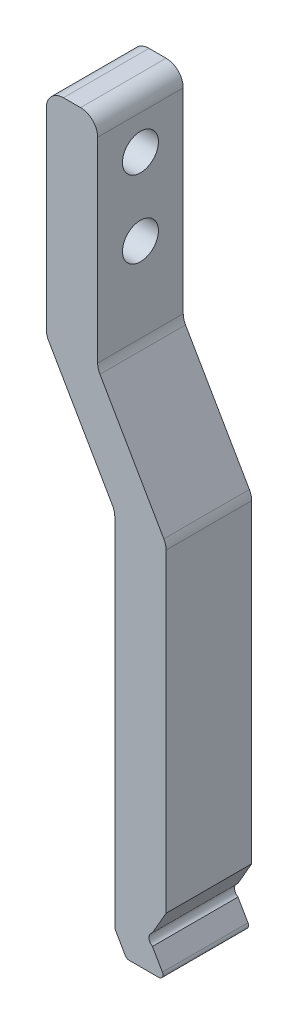
ISO-10303-21;
HEADER;
FILE_DESCRIPTION(('STEP AP214'),'2;1');
FILE_NAME('part.step','',(''),(''),'','','');
FILE_SCHEMA(('AUTOMOTIVE_DESIGN { 1 0 10303 214 1 1 1 1 }'));
ENDSEC;
DATA;
#1=APPLICATION_CONTEXT('core data for automotive mechanical design processes');
#2=APPLICATION_PROTOCOL_DEFINITION('international standard','automotive_design',2000,#1);
#3=PRODUCT_CONTEXT('',#1,'mechanical');
#4=PRODUCT('Part','Part','',(#3));
#5=PRODUCT_RELATED_PRODUCT_CATEGORY('part','',(#4));
#6=PRODUCT_DEFINITION_FORMATION('','',#4);
#7=PRODUCT_DEFINITION_CONTEXT('part definition',#1,'design');
#8=PRODUCT_DEFINITION('design','',#6,#7);
#9=PRODUCT_DEFINITION_SHAPE('','',#8);
#10=(LENGTH_UNIT() NAMED_UNIT(*) SI_UNIT(.MILLI.,.METRE.));
#11=(NAMED_UNIT(*) PLANE_ANGLE_UNIT() SI_UNIT($,.RADIAN.));
#12=(NAMED_UNIT(*) SI_UNIT($,.STERADIAN.) SOLID_ANGLE_UNIT());
#13=UNCERTAINTY_MEASURE_WITH_UNIT(LENGTH_MEASURE(1.E-05),#10,'distance_accuracy_value','');
#14=(GEOMETRIC_REPRESENTATION_CONTEXT(3) GLOBAL_UNCERTAINTY_ASSIGNED_CONTEXT((#13)) GLOBAL_UNIT_ASSIGNED_CONTEXT((#10,
#11,#12)) REPRESENTATION_CONTEXT('',''));
#15=CARTESIAN_POINT('',(0.,0.,0.));
#16=DIRECTION('',(0.,0.,1.));
#17=DIRECTION('',(1.,0.,0.));
#18=AXIS2_PLACEMENT_3D('',#15,#16,#17);
#19=CARTESIAN_POINT('',(-9.00000000000001,40.7512886940358,10.));
#20=DIRECTION('',(-1.,0.,0.));
#21=DIRECTION('',(0.,-1.,0.));
#22=AXIS2_PLACEMENT_3D('',#19,#20,#21);
#23=PLANE('',#22);
#24=DIRECTION('',(0.,1.,0.));
#25=VECTOR('',#24,1.);
#26=CARTESIAN_POINT('',(-9.00000000000001,40.7512886940358,0.));
#27=LINE('',#26,#25);
#28=CARTESIAN_POINT('',(-9.,3.46410161513776,0.));
#29=VERTEX_POINT('',#28);
#30=CARTESIAN_POINT('',(-9.00000000000001,40.2153903091735,0.));
#31=VERTEX_POINT('',#30);
#32=EDGE_CURVE('E206',#29,#31,#27,.T.);
#33=ORIENTED_EDGE('',*,*,#32,.T.);
#34=DIRECTION('',(0.,0.,-1.));
#35=VECTOR('',#34,1.);
#36=CARTESIAN_POINT('',(-9.00000000000001,40.2153903091735,10.));
#37=LINE('',#36,#35);
#38=CARTESIAN_POINT('',(-9.00000000000001,40.2153903091735,10.));
#39=VERTEX_POINT('',#38);
#40=EDGE_CURVE('E287',#31,#39,#37,.F.);
#41=ORIENTED_EDGE('',*,*,#40,.T.);
#42=DIRECTION('',(0.,1.,0.));
#43=VECTOR('',#42,1.);
#44=CARTESIAN_POINT('',(-9.00000000000001,40.7512886940358,10.));
#45=LINE('',#44,#43);
#46=CARTESIAN_POINT('',(-9.,3.46410161513776,10.));
#47=VERTEX_POINT('',#46);
#48=EDGE_CURVE('E207',#47,#39,#45,.T.);
#49=ORIENTED_EDGE('',*,*,#48,.F.);
#50=DIRECTION('',(0.,0.,-1.));
#51=VECTOR('',#50,1.);
#52=CARTESIAN_POINT('',(-9.,3.46410161513776,10.));
#53=LINE('',#52,#51);
#54=EDGE_CURVE('E192',#47,#29,#53,.T.);
#55=ORIENTED_EDGE('',*,*,#54,.T.);
#56=EDGE_LOOP('',(#33,#41,#49,#55));
#57=FACE_BOUND('',#56,.T.);
#58=ADVANCED_FACE('F35',(#57),#23,.F.);
#59=CARTESIAN_POINT('',(-17.,54.6076951545868,10.));
#60=DIRECTION('',(-0.866025403784439,-0.5,0.));
#61=DIRECTION('',(0.5,-0.866025403784439,0.));
#62=AXIS2_PLACEMENT_3D('',#59,#60,#61);
#63=PLANE('',#62);
#64=DIRECTION('',(-0.5,0.866025403784438,0.));
#65=VECTOR('',#64,1.);
#66=CARTESIAN_POINT('',(-17.,54.6076951545868,0.));
#67=LINE('',#66,#65);
#68=CARTESIAN_POINT('',(-9.26794919243113,41.2153903091735,0.));
#69=VERTEX_POINT('',#68);
#70=CARTESIAN_POINT('',(-16.7320508075689,54.143593539449,0.));
#71=VERTEX_POINT('',#70);
#72=EDGE_CURVE('E295',#69,#71,#67,.T.);
#73=ORIENTED_EDGE('',*,*,#72,.T.);
#74=DIRECTION('',(0.,0.,-1.));
#75=VECTOR('',#74,1.);
#76=CARTESIAN_POINT('',(-16.7320508075689,54.143593539449,10.));
#77=LINE('',#76,#75);
#78=CARTESIAN_POINT('',(-16.7320508075689,54.143593539449,10.));
#79=VERTEX_POINT('',#78);
#80=EDGE_CURVE('E285',#71,#79,#77,.F.);
#81=ORIENTED_EDGE('',*,*,#80,.T.);
#82=DIRECTION('',(-0.5,0.866025403784438,0.));
#83=VECTOR('',#82,1.);
#84=CARTESIAN_POINT('',(-17.,54.6076951545868,10.));
#85=LINE('',#84,#83);
#86=CARTESIAN_POINT('',(-9.26794919243113,41.2153903091735,10.));
#87=VERTEX_POINT('',#86);
#88=EDGE_CURVE('E211',#87,#79,#85,.T.);
#89=ORIENTED_EDGE('',*,*,#88,.F.);
#90=DIRECTION('',(0.,0.,-1.));
#91=VECTOR('',#90,1.);
#92=CARTESIAN_POINT('',(-9.26794919243113,41.2153903091735,10.));
#93=LINE('',#92,#91);
#94=EDGE_CURVE('E282',#87,#69,#93,.T.);
#95=ORIENTED_EDGE('',*,*,#94,.T.);
#96=EDGE_LOOP('',(#73,#81,#89,#95));
#97=FACE_BOUND('',#96,.T.);
#98=ADVANCED_FACE('F302',(#97),#63,.F.);
#99=CARTESIAN_POINT('',(-17.,80.,10.));
#100=DIRECTION('',(-1.,0.,0.));
#101=DIRECTION('',(0.,-1.,0.));
#102=AXIS2_PLACEMENT_3D('',#99,#100,#101);
#103=PLANE('',#102);
#104=CARTESIAN_POINT('',(-17.,65.,5.));
#105=DIRECTION('',(1.,0.,0.));
#106=DIRECTION('',(0.,1.,0.));
#107=AXIS2_PLACEMENT_3D('',#104,#105,#106);
#108=CIRCLE('',#107,2.1);
#109=CARTESIAN_POINT('',(-17.,67.1,5.));
#110=VERTEX_POINT('',#109);
#111=EDGE_CURVE('E370',#110,#110,#108,.T.);
#112=ORIENTED_EDGE('',*,*,#111,.F.);
#113=EDGE_LOOP('',(#112));
#114=FACE_BOUND('',#113,.T.);
#115=CARTESIAN_POINT('',(-17.,74.,5.));
#116=DIRECTION('',(1.,0.,0.));
#117=DIRECTION('',(0.,1.,0.));
#118=AXIS2_PLACEMENT_3D('',#115,#116,#117);
#119=CIRCLE('',#118,2.1);
#120=CARTESIAN_POINT('',(-17.,76.1,5.));
#121=VERTEX_POINT('',#120);
#122=EDGE_CURVE('E361',#121,#121,#119,.T.);
#123=ORIENTED_EDGE('',*,*,#122,.F.);
#124=EDGE_LOOP('',(#123));
#125=FACE_BOUND('',#124,.T.);
#126=DIRECTION('',(0.,1.,0.));
#127=VECTOR('',#126,1.);
#128=CARTESIAN_POINT('',(-17.,80.,10.));
#129=LINE('',#128,#127);
#130=CARTESIAN_POINT('',(-17.,55.143593539449,10.));
#131=VERTEX_POINT('',#130);
#132=CARTESIAN_POINT('',(-17.,78.,10.));
#133=VERTEX_POINT('',#132);
#134=EDGE_CURVE('E312',#131,#133,#129,.T.);
#135=ORIENTED_EDGE('',*,*,#134,.F.);
#136=DIRECTION('',(0.,0.,-1.));
#137=VECTOR('',#136,1.);
#138=CARTESIAN_POINT('',(-17.,55.143593539449,0.));
#139=LINE('',#138,#137);
#140=CARTESIAN_POINT('',(-17.,55.143593539449,0.));
#141=VERTEX_POINT('',#140);
#142=EDGE_CURVE('E279',#131,#141,#139,.T.);
#143=ORIENTED_EDGE('',*,*,#142,.T.);
#144=DIRECTION('',(0.,1.,0.));
#145=VECTOR('',#144,1.);
#146=CARTESIAN_POINT('',(-17.,80.,0.));
#147=LINE('',#146,#145);
#148=CARTESIAN_POINT('',(-17.,78.,0.));
#149=VERTEX_POINT('',#148);
#150=EDGE_CURVE('E297',#141,#149,#147,.T.);
#151=ORIENTED_EDGE('',*,*,#150,.T.);
#152=DIRECTION('',(0.,0.,-1.));
#153=VECTOR('',#152,1.);
#154=CARTESIAN_POINT('',(-17.,78.,10.));
#155=LINE('',#154,#153);
#156=EDGE_CURVE('E277',#149,#133,#155,.F.);
#157=ORIENTED_EDGE('',*,*,#156,.T.);
#158=EDGE_LOOP('',(#135,#143,#151,#157));
#159=FACE_BOUND('',#158,.T.);
#160=ADVANCED_FACE('F314',(#114,#125,#159),#103,.F.);
#161=CARTESIAN_POINT('',(-17.,80.,10.));
#162=DIRECTION('',(0.,-1.,0.));
#163=DIRECTION('',(1.,0.,0.));
#164=AXIS2_PLACEMENT_3D('',#161,#162,#163);
#165=PLANE('',#164);
#166=DIRECTION('',(-1.,0.,0.));
#167=VECTOR('',#166,1.);
#168=CARTESIAN_POINT('',(-17.,80.,0.));
#169=LINE('',#168,#167);
#170=CARTESIAN_POINT('',(-19.,80.,0.));
#171=VERTEX_POINT('',#170);
#172=CARTESIAN_POINT('',(-21.,80.,0.));
#173=VERTEX_POINT('',#172);
#174=EDGE_CURVE('E337',#171,#173,#169,.T.);
#175=ORIENTED_EDGE('',*,*,#174,.T.);
#176=DIRECTION('',(0.,0.,-1.));
#177=VECTOR('',#176,1.);
#178=CARTESIAN_POINT('',(-21.,80.,10.));
#179=LINE('',#178,#177);
#180=CARTESIAN_POINT('',(-21.,80.,10.));
#181=VERTEX_POINT('',#180);
#182=EDGE_CURVE('E50',#173,#181,#179,.F.);
#183=ORIENTED_EDGE('',*,*,#182,.T.);
#184=DIRECTION('',(-1.,0.,0.));
#185=VECTOR('',#184,1.);
#186=CARTESIAN_POINT('',(-17.,80.,10.));
#187=LINE('',#186,#185);
#188=CARTESIAN_POINT('',(-19.,80.,10.));
#189=VERTEX_POINT('',#188);
#190=EDGE_CURVE('E316',#189,#181,#187,.T.);
#191=ORIENTED_EDGE('',*,*,#190,.F.);
#192=DIRECTION('',(0.,0.,-1.));
#193=VECTOR('',#192,1.);
#194=CARTESIAN_POINT('',(-19.,80.,10.));
#195=LINE('',#194,#193);
#196=EDGE_CURVE('E273',#189,#171,#195,.T.);
#197=ORIENTED_EDGE('',*,*,#196,.T.);
#198=EDGE_LOOP('',(#175,#183,#191,#197));
#199=FACE_BOUND('',#198,.T.);
#200=ADVANCED_FACE('F387',(#199),#165,.F.);
#201=CARTESIAN_POINT('',(-23.,80.,10.));
#202=DIRECTION('',(1.,0.,0.));
#203=DIRECTION('',(0.,1.,0.));
#204=AXIS2_PLACEMENT_3D('',#201,#202,#203);
#205=PLANE('',#204);
#206=CARTESIAN_POINT('',(-23.,65.,5.));
#207=DIRECTION('',(1.,0.,0.));
#208=DIRECTION('',(0.,1.,0.));
#209=AXIS2_PLACEMENT_3D('',#206,#207,#208);
#210=CIRCLE('',#209,2.1);
#211=CARTESIAN_POINT('',(-23.,67.1,5.));
#212=VERTEX_POINT('',#211);
#213=EDGE_CURVE('E334',#212,#212,#210,.T.);
#214=ORIENTED_EDGE('',*,*,#213,.T.);
#215=EDGE_LOOP('',(#214));
#216=FACE_BOUND('',#215,.T.);
#217=CARTESIAN_POINT('',(-23.,74.,5.));
#218=DIRECTION('',(1.,0.,0.));
#219=DIRECTION('',(0.,1.,0.));
#220=AXIS2_PLACEMENT_3D('',#217,#218,#219);
#221=CIRCLE('',#220,2.1);
#222=CARTESIAN_POINT('',(-23.,76.1,5.));
#223=VERTEX_POINT('',#222);
#224=EDGE_CURVE('E364',#223,#223,#221,.T.);
#225=ORIENTED_EDGE('',*,*,#224,.T.);
#226=EDGE_LOOP('',(#225));
#227=FACE_BOUND('',#226,.T.);
#228=DIRECTION('',(0.,-1.,0.));
#229=VECTOR('',#228,1.);
#230=CARTESIAN_POINT('',(-23.,80.,0.));
#231=LINE('',#230,#229);
#232=CARTESIAN_POINT('',(-23.,78.,0.));
#233=VERTEX_POINT('',#232);
#234=CARTESIAN_POINT('',(-23.,55.5358983848623,0.));
#235=VERTEX_POINT('',#234);
#236=EDGE_CURVE('E339',#233,#235,#231,.T.);
#237=ORIENTED_EDGE('',*,*,#236,.T.);
#238=DIRECTION('',(0.,0.,-1.));
#239=VECTOR('',#238,1.);
#240=CARTESIAN_POINT('',(-23.,55.5358983848623,10.));
#241=LINE('',#240,#239);
#242=CARTESIAN_POINT('',(-23.,55.5358983848623,10.));
#243=VERTEX_POINT('',#242);
#244=EDGE_CURVE('E264',#235,#243,#241,.F.);
#245=ORIENTED_EDGE('',*,*,#244,.T.);
#246=DIRECTION('',(0.,-1.,0.));
#247=VECTOR('',#246,1.);
#248=CARTESIAN_POINT('',(-23.,80.,10.));
#249=LINE('',#248,#247);
#250=CARTESIAN_POINT('',(-23.,78.,10.));
#251=VERTEX_POINT('',#250);
#252=EDGE_CURVE('E318',#251,#243,#249,.T.);
#253=ORIENTED_EDGE('',*,*,#252,.F.);
#254=DIRECTION('',(0.,0.,-1.));
#255=VECTOR('',#254,1.);
#256=CARTESIAN_POINT('',(-23.,78.,10.));
#257=LINE('',#256,#255);
#258=EDGE_CURVE('E261',#251,#233,#257,.T.);
#259=ORIENTED_EDGE('',*,*,#258,.T.);
#260=EDGE_LOOP('',(#237,#245,#253,#259));
#261=FACE_BOUND('',#260,.T.);
#262=ADVANCED_FACE('F376',(#216,#227,#261),#205,.F.);
#263=CARTESIAN_POINT('',(-23.,55.,10.));
#264=DIRECTION('',(0.866025403784439,0.5,0.));
#265=DIRECTION('',(-0.5,0.866025403784439,0.));
#266=AXIS2_PLACEMENT_3D('',#263,#264,#265);
#267=PLANE('',#266);
#268=DIRECTION('',(0.5,-0.866025403784438,0.));
#269=VECTOR('',#268,1.);
#270=CARTESIAN_POINT('',(-23.,55.,0.));
#271=LINE('',#270,#269);
#272=CARTESIAN_POINT('',(-22.7320508075689,54.5358983848623,0.));
#273=VERTEX_POINT('',#272);
#274=CARTESIAN_POINT('',(-15.2679491924311,41.6076951545868,0.));
#275=VERTEX_POINT('',#274);
#276=EDGE_CURVE('E342',#273,#275,#271,.T.);
#277=ORIENTED_EDGE('',*,*,#276,.T.);
#278=DIRECTION('',(0.,0.,-1.));
#279=VECTOR('',#278,1.);
#280=CARTESIAN_POINT('',(-15.2679491924311,41.6076951545868,10.));
#281=LINE('',#280,#279);
#282=CARTESIAN_POINT('',(-15.2679491924311,41.6076951545868,10.));
#283=VERTEX_POINT('',#282);
#284=EDGE_CURVE('E251',#275,#283,#281,.F.);
#285=ORIENTED_EDGE('',*,*,#284,.T.);
#286=DIRECTION('',(0.5,-0.866025403784438,0.));
#287=VECTOR('',#286,1.);
#288=CARTESIAN_POINT('',(-23.,55.,10.));
#289=LINE('',#288,#287);
#290=CARTESIAN_POINT('',(-22.7320508075689,54.5358983848623,10.));
#291=VERTEX_POINT('',#290);
#292=EDGE_CURVE('E323',#291,#283,#289,.T.);
#293=ORIENTED_EDGE('',*,*,#292,.F.);
#294=DIRECTION('',(0.,0.,-1.));
#295=VECTOR('',#294,1.);
#296=CARTESIAN_POINT('',(-22.7320508075689,54.5358983848623,10.));
#297=LINE('',#296,#295);
#298=EDGE_CURVE('E248',#291,#273,#297,.T.);
#299=ORIENTED_EDGE('',*,*,#298,.T.);
#300=EDGE_LOOP('',(#277,#285,#293,#299));
#301=FACE_BOUND('',#300,.T.);
#302=ADVANCED_FACE('F460',(#301),#267,.F.);
#303=CARTESIAN_POINT('',(-15.,41.143593539449,10.));
#304=DIRECTION('',(1.,0.,0.));
#305=DIRECTION('',(0.,1.,0.));
#306=AXIS2_PLACEMENT_3D('',#303,#304,#305);
#307=PLANE('',#306);
#308=DIRECTION('',(0.,-1.,0.));
#309=VECTOR('',#308,1.);
#310=CARTESIAN_POINT('',(-15.,41.143593539449,10.));
#311=LINE('',#310,#309);
#312=CARTESIAN_POINT('',(-15.,40.6076951545868,10.));
#313=VERTEX_POINT('',#312);
#314=CARTESIAN_POINT('',(-15.,-0.937822173508934,10.));
#315=VERTEX_POINT('',#314);
#316=EDGE_CURVE('E326',#313,#315,#311,.T.);
#317=ORIENTED_EDGE('',*,*,#316,.F.);
#318=DIRECTION('',(0.,0.,-1.));
#319=VECTOR('',#318,1.);
#320=CARTESIAN_POINT('',(-15.,40.6076951545868,0.));
#321=LINE('',#320,#319);
#322=CARTESIAN_POINT('',(-15.,40.6076951545868,0.));
#323=VERTEX_POINT('',#322);
#324=EDGE_CURVE('E245',#313,#323,#321,.T.);
#325=ORIENTED_EDGE('',*,*,#324,.T.);
#326=DIRECTION('',(0.,-1.,0.));
#327=VECTOR('',#326,1.);
#328=CARTESIAN_POINT('',(-15.,41.143593539449,0.));
#329=LINE('',#328,#327);
#330=CARTESIAN_POINT('',(-15.,-0.937822173508934,0.));
#331=VERTEX_POINT('',#330);
#332=EDGE_CURVE('E345',#323,#331,#329,.T.);
#333=ORIENTED_EDGE('',*,*,#332,.T.);
#334=DIRECTION('',(0.,0.,1.));
#335=VECTOR('',#334,1.);
#336=CARTESIAN_POINT('',(-15.,-0.937822173508934,10.));
#337=LINE('',#336,#335);
#338=EDGE_CURVE('E237',#331,#315,#337,.T.);
#339=ORIENTED_EDGE('',*,*,#338,.T.);
#340=EDGE_LOOP('',(#317,#325,#333,#339));
#341=FACE_BOUND('',#340,.T.);
#342=ADVANCED_FACE('F454',(#341),#307,.F.);
#343=CARTESIAN_POINT('',(-15.,-3.46410161513775,10.));
#344=DIRECTION('',(0.,1.,0.));
#345=DIRECTION('',(-1.,0.,0.));
#346=AXIS2_PLACEMENT_3D('',#343,#344,#345);
#347=PLANE('',#346);
#348=DIRECTION('',(1.,0.,0.));
#349=VECTOR('',#348,1.);
#350=CARTESIAN_POINT('',(-15.,-3.46410161513775,0.));
#351=LINE('',#350,#349);
#352=CARTESIAN_POINT('',(-13.3301270189222,-3.46410161513775,0.));
#353=VERTEX_POINT('',#352);
#354=CARTESIAN_POINT('',(-9.86602540378444,-3.46410161513775,0.));
#355=VERTEX_POINT('',#354);
#356=EDGE_CURVE('E213',#353,#355,#351,.T.);
#357=ORIENTED_EDGE('',*,*,#356,.T.);
#358=DIRECTION('',(0.,0.,-1.));
#359=VECTOR('',#358,1.);
#360=CARTESIAN_POINT('',(-9.86602540378444,-3.46410161513775,10.));
#361=LINE('',#360,#359);
#362=CARTESIAN_POINT('',(-9.86602540378444,-3.46410161513775,10.));
#363=VERTEX_POINT('',#362);
#364=EDGE_CURVE('E229',#355,#363,#361,.F.);
#365=ORIENTED_EDGE('',*,*,#364,.T.);
#366=DIRECTION('',(1.,0.,0.));
#367=VECTOR('',#366,1.);
#368=CARTESIAN_POINT('',(-15.,-3.46410161513775,10.));
#369=LINE('',#368,#367);
#370=CARTESIAN_POINT('',(-13.3301270189222,-3.46410161513775,10.));
#371=VERTEX_POINT('',#370);
#372=EDGE_CURVE('E328',#371,#363,#369,.T.);
#373=ORIENTED_EDGE('',*,*,#372,.F.);
#374=DIRECTION('',(0.,0.,1.));
#375=VECTOR('',#374,1.);
#376=CARTESIAN_POINT('',(-13.3301270189222,-3.46410161513775,10.));
#377=LINE('',#376,#375);
#378=EDGE_CURVE('E227',#371,#353,#377,.F.);
#379=ORIENTED_EDGE('',*,*,#378,.T.);
#380=EDGE_LOOP('',(#357,#365,#373,#379));
#381=FACE_BOUND('',#380,.T.);
#382=ADVANCED_FACE('F350',(#381),#347,.F.);
#383=CARTESIAN_POINT('',(-11.,0.,10.));
#384=DIRECTION('',(-0.866025403784439,-0.5,0.));
#385=DIRECTION('',(0.5,-0.866025403784439,0.));
#386=AXIS2_PLACEMENT_3D('',#383,#384,#385);
#387=PLANE('',#386);
#388=DIRECTION('',(-0.5,0.866025403784439,0.));
#389=VECTOR('',#388,1.);
#390=CARTESIAN_POINT('',(-11.,0.,10.));
#391=LINE('',#390,#389);
#392=CARTESIAN_POINT('',(-9.43301270189222,-2.71410161513775,10.));
#393=VERTEX_POINT('',#392);
#394=CARTESIAN_POINT('',(-10.6,-0.692820323027549,10.));
#395=VERTEX_POINT('',#394);
#396=EDGE_CURVE('E331',#393,#395,#391,.T.);
#397=ORIENTED_EDGE('',*,*,#396,.F.);
#398=DIRECTION('',(0.,0.,-1.));
#399=VECTOR('',#398,1.);
#400=CARTESIAN_POINT('',(-9.43301270189222,-2.71410161513775,10.));
#401=LINE('',#400,#399);
#402=CARTESIAN_POINT('',(-9.43301270189222,-2.71410161513775,0.));
#403=VERTEX_POINT('',#402);
#404=EDGE_CURVE('E191',#393,#403,#401,.T.);
#405=ORIENTED_EDGE('',*,*,#404,.T.);
#406=DIRECTION('',(-0.5,0.866025403784439,0.));
#407=VECTOR('',#406,1.);
#408=CARTESIAN_POINT('',(-11.,0.,0.));
#409=LINE('',#408,#407);
#410=CARTESIAN_POINT('',(-10.6,-0.69282032302755,0.));
#411=VERTEX_POINT('',#410);
#412=EDGE_CURVE('E208',#403,#411,#409,.T.);
#413=ORIENTED_EDGE('',*,*,#412,.T.);
#414=DIRECTION('',(0.,0.,1.));
#415=VECTOR('',#414,1.);
#416=CARTESIAN_POINT('',(-10.6,-0.692820323027548,0.));
#417=LINE('',#416,#415);
#418=EDGE_CURVE('E187',#411,#395,#417,.T.);
#419=ORIENTED_EDGE('',*,*,#418,.T.);
#420=EDGE_LOOP('',(#397,#405,#413,#419));
#421=FACE_BOUND('',#420,.T.);
#422=ADVANCED_FACE('F360',(#421),#387,.F.);
#423=CARTESIAN_POINT('',(-9.,3.46410161513776,10.));
#424=DIRECTION('',(-0.866025403784439,0.499999999999999,0.));
#425=DIRECTION('',(-0.499999999999999,-0.866025403784439,0.));
#426=AXIS2_PLACEMENT_3D('',#423,#424,#425);
#427=PLANE('',#426);
#428=DIRECTION('',(0.499999999999999,0.866025403784439,0.));
#429=VECTOR('',#428,1.);
#430=CARTESIAN_POINT('',(-9.,3.46410161513776,10.));
#431=LINE('',#430,#429);
#432=CARTESIAN_POINT('',(-10.6,0.692820323027554,10.));
#433=VERTEX_POINT('',#432);
#434=EDGE_CURVE('E199',#433,#47,#431,.T.);
#435=ORIENTED_EDGE('',*,*,#434,.F.);
#436=DIRECTION('',(0.,0.,1.));
#437=VECTOR('',#436,1.);
#438=CARTESIAN_POINT('',(-10.6,0.692820323027555,0.));
#439=LINE('',#438,#437);
#440=CARTESIAN_POINT('',(-10.6,0.692820323027554,0.));
#441=VERTEX_POINT('',#440);
#442=EDGE_CURVE('E184',#433,#441,#439,.F.);
#443=ORIENTED_EDGE('',*,*,#442,.T.);
#444=DIRECTION('',(0.499999999999999,0.866025403784439,0.));
#445=VECTOR('',#444,1.);
#446=CARTESIAN_POINT('',(-9.,3.46410161513776,0.));
#447=LINE('',#446,#445);
#448=EDGE_CURVE('E197',#441,#29,#447,.T.);
#449=ORIENTED_EDGE('',*,*,#448,.T.);
#450=ORIENTED_EDGE('',*,*,#54,.F.);
#451=EDGE_LOOP('',(#435,#443,#449,#450));
#452=FACE_BOUND('',#451,.T.);
#453=ADVANCED_FACE('F195',(#452),#427,.F.);
#454=CARTESIAN_POINT('',(0.,0.,10.));
#455=DIRECTION('',(0.,0.,1.));
#456=DIRECTION('',(1.,0.,0.));
#457=AXIS2_PLACEMENT_3D('',#454,#455,#456);
#458=PLANE('',#457);
#459=ORIENTED_EDGE('',*,*,#252,.T.);
#460=CARTESIAN_POINT('',(-21.,55.5358983848623,10.));
#461=DIRECTION('',(0.,0.,1.));
#462=DIRECTION('',(1.,0.,0.));
#463=AXIS2_PLACEMENT_3D('',#460,#461,#462);
#464=CIRCLE('',#463,2.);
#465=EDGE_CURVE('E271',#243,#291,#464,.T.);
#466=ORIENTED_EDGE('',*,*,#465,.T.);
#467=ORIENTED_EDGE('',*,*,#292,.T.);
#468=CARTESIAN_POINT('',(-17.,40.6076951545868,10.));
#469=DIRECTION('',(0.,0.,1.));
#470=DIRECTION('',(1.,0.,0.));
#471=AXIS2_PLACEMENT_3D('',#468,#469,#470);
#472=CIRCLE('',#471,2.);
#473=EDGE_CURVE('E291',#283,#313,#472,.F.);
#474=ORIENTED_EDGE('',*,*,#473,.T.);
#475=ORIENTED_EDGE('',*,*,#316,.T.);
#476=CARTESIAN_POINT('',(-14.5,-0.937822173508934,10.));
#477=DIRECTION('',(0.,0.,1.));
#478=DIRECTION('',(1.,0.,0.));
#479=AXIS2_PLACEMENT_3D('',#476,#477,#478);
#480=CIRCLE('',#479,0.5);
#481=CARTESIAN_POINT('',(-14.9330127018922,-1.18782217350893,10.));
#482=VERTEX_POINT('',#481);
#483=EDGE_CURVE('E233',#315,#482,#480,.T.);
#484=ORIENTED_EDGE('',*,*,#483,.T.);
#485=DIRECTION('',(-0.5,0.866025403784438,0.));
#486=VECTOR('',#485,1.);
#487=CARTESIAN_POINT('',(-15.,-1.07179676972449,10.));
#488=LINE('',#487,#486);
#489=CARTESIAN_POINT('',(-13.7631397208144,-3.21410161513775,10.));
#490=VERTEX_POINT('',#489);
#491=EDGE_CURVE('E439',#490,#482,#488,.T.);
#492=ORIENTED_EDGE('',*,*,#491,.F.);
#493=CARTESIAN_POINT('',(-13.3301270189222,-2.96410161513775,10.));
#494=DIRECTION('',(0.,0.,1.));
#495=DIRECTION('',(1.,0.,0.));
#496=AXIS2_PLACEMENT_3D('',#493,#494,#495);
#497=CIRCLE('',#496,0.5);
#498=EDGE_CURVE('E231',#490,#371,#497,.T.);
#499=ORIENTED_EDGE('',*,*,#498,.T.);
#500=ORIENTED_EDGE('',*,*,#372,.T.);
#501=CARTESIAN_POINT('',(-9.86602540378444,-2.96410161513775,10.));
#502=DIRECTION('',(0.,0.,1.));
#503=DIRECTION('',(1.,0.,0.));
#504=AXIS2_PLACEMENT_3D('',#501,#502,#503);
#505=CIRCLE('',#504,0.5);
#506=EDGE_CURVE('E235',#363,#393,#505,.T.);
#507=ORIENTED_EDGE('',*,*,#506,.T.);
#508=ORIENTED_EDGE('',*,*,#396,.T.);
#509=CARTESIAN_POINT('',(-10.2,0.,10.));
#510=DIRECTION('',(0.,0.,1.));
#511=DIRECTION('',(1.,0.,0.));
#512=AXIS2_PLACEMENT_3D('',#509,#510,#511);
#513=CIRCLE('',#512,0.800000000000001);
#514=EDGE_CURVE('E200',#433,#395,#513,.T.);
#515=ORIENTED_EDGE('',*,*,#514,.F.);
#516=ORIENTED_EDGE('',*,*,#434,.T.);
#517=ORIENTED_EDGE('',*,*,#48,.T.);
#518=CARTESIAN_POINT('',(-11.,40.2153903091735,10.));
#519=DIRECTION('',(0.,0.,1.));
#520=DIRECTION('',(1.,0.,0.));
#521=AXIS2_PLACEMENT_3D('',#518,#519,#520);
#522=CIRCLE('',#521,2.);
#523=EDGE_CURVE('E267',#39,#87,#522,.T.);
#524=ORIENTED_EDGE('',*,*,#523,.T.);
#525=ORIENTED_EDGE('',*,*,#88,.T.);
#526=CARTESIAN_POINT('',(-15.,55.143593539449,10.));
#527=DIRECTION('',(0.,0.,1.));
#528=DIRECTION('',(1.,0.,0.));
#529=AXIS2_PLACEMENT_3D('',#526,#527,#528);
#530=CIRCLE('',#529,2.);
#531=EDGE_CURVE('E11',#79,#131,#530,.F.);
#532=ORIENTED_EDGE('',*,*,#531,.T.);
#533=ORIENTED_EDGE('',*,*,#134,.T.);
#534=CARTESIAN_POINT('',(-19.,78.,10.));
#535=DIRECTION('',(0.,0.,1.));
#536=DIRECTION('',(1.,0.,0.));
#537=AXIS2_PLACEMENT_3D('',#534,#535,#536);
#538=CIRCLE('',#537,2.);
#539=EDGE_CURVE('E57',#133,#189,#538,.T.);
#540=ORIENTED_EDGE('',*,*,#539,.T.);
#541=ORIENTED_EDGE('',*,*,#190,.T.);
#542=CARTESIAN_POINT('',(-21.,78.,10.));
#543=DIRECTION('',(0.,0.,1.));
#544=DIRECTION('',(1.,0.,0.));
#545=AXIS2_PLACEMENT_3D('',#542,#543,#544);
#546=CIRCLE('',#545,2.);
#547=EDGE_CURVE('E269',#181,#251,#546,.T.);
#548=ORIENTED_EDGE('',*,*,#547,.T.);
#549=EDGE_LOOP('',(#459,#466,#467,#474,#475,#484,#492,#499,#500,#507,#508,#515,#516,#517,#524,
#525,#532,#533,#540,#541,#548));
#550=FACE_BOUND('',#549,.T.);
#551=ADVANCED_FACE('F311',(#550),#458,.T.);
#552=CARTESIAN_POINT('',(0.,0.,0.));
#553=DIRECTION('',(0.,0.,1.));
#554=DIRECTION('',(1.,0.,0.));
#555=AXIS2_PLACEMENT_3D('',#552,#553,#554);
#556=PLANE('',#555);
#557=ORIENTED_EDGE('',*,*,#276,.F.);
#558=CARTESIAN_POINT('',(-21.,55.5358983848623,0.));
#559=DIRECTION('',(0.,0.,1.));
#560=DIRECTION('',(1.,0.,0.));
#561=AXIS2_PLACEMENT_3D('',#558,#559,#560);
#562=CIRCLE('',#561,2.);
#563=EDGE_CURVE('E259',#273,#235,#562,.F.);
#564=ORIENTED_EDGE('',*,*,#563,.T.);
#565=ORIENTED_EDGE('',*,*,#236,.F.);
#566=CARTESIAN_POINT('',(-21.,78.,0.));
#567=DIRECTION('',(0.,0.,1.));
#568=DIRECTION('',(1.,0.,0.));
#569=AXIS2_PLACEMENT_3D('',#566,#567,#568);
#570=CIRCLE('',#569,2.);
#571=EDGE_CURVE('E257',#233,#173,#570,.F.);
#572=ORIENTED_EDGE('',*,*,#571,.T.);
#573=ORIENTED_EDGE('',*,*,#174,.F.);
#574=CARTESIAN_POINT('',(-19.,78.,0.));
#575=DIRECTION('',(0.,0.,1.));
#576=DIRECTION('',(1.,0.,0.));
#577=AXIS2_PLACEMENT_3D('',#574,#575,#576);
#578=CIRCLE('',#577,2.);
#579=EDGE_CURVE('E253',#171,#149,#578,.F.);
#580=ORIENTED_EDGE('',*,*,#579,.T.);
#581=ORIENTED_EDGE('',*,*,#150,.F.);
#582=CARTESIAN_POINT('',(-15.,55.143593539449,0.));
#583=DIRECTION('',(0.,0.,1.));
#584=DIRECTION('',(1.,0.,0.));
#585=AXIS2_PLACEMENT_3D('',#582,#583,#584);
#586=CIRCLE('',#585,2.);
#587=EDGE_CURVE('E43',#141,#71,#586,.T.);
#588=ORIENTED_EDGE('',*,*,#587,.T.);
#589=ORIENTED_EDGE('',*,*,#72,.F.);
#590=CARTESIAN_POINT('',(-11.,40.2153903091735,0.));
#591=DIRECTION('',(0.,0.,1.));
#592=DIRECTION('',(1.,0.,0.));
#593=AXIS2_PLACEMENT_3D('',#590,#591,#592);
#594=CIRCLE('',#593,2.);
#595=EDGE_CURVE('E255',#69,#31,#594,.F.);
#596=ORIENTED_EDGE('',*,*,#595,.T.);
#597=ORIENTED_EDGE('',*,*,#32,.F.);
#598=ORIENTED_EDGE('',*,*,#448,.F.);
#599=CARTESIAN_POINT('',(-10.2,0.,0.));
#600=DIRECTION('',(0.,0.,1.));
#601=DIRECTION('',(1.,0.,0.));
#602=AXIS2_PLACEMENT_3D('',#599,#600,#601);
#603=CIRCLE('',#602,0.800000000000001);
#604=EDGE_CURVE('E180',#441,#411,#603,.T.);
#605=ORIENTED_EDGE('',*,*,#604,.T.);
#606=ORIENTED_EDGE('',*,*,#412,.F.);
#607=CARTESIAN_POINT('',(-9.86602540378444,-2.96410161513775,0.));
#608=DIRECTION('',(0.,0.,1.));
#609=DIRECTION('',(1.,0.,0.));
#610=AXIS2_PLACEMENT_3D('',#607,#608,#609);
#611=CIRCLE('',#610,0.5);
#612=EDGE_CURVE('E225',#403,#355,#611,.F.);
#613=ORIENTED_EDGE('',*,*,#612,.T.);
#614=ORIENTED_EDGE('',*,*,#356,.F.);
#615=CARTESIAN_POINT('',(-13.3301270189222,-2.96410161513775,0.));
#616=DIRECTION('',(0.,0.,1.));
#617=DIRECTION('',(1.,0.,0.));
#618=AXIS2_PLACEMENT_3D('',#615,#616,#617);
#619=CIRCLE('',#618,0.5);
#620=CARTESIAN_POINT('',(-13.7631397208144,-3.21410161513775,0.));
#621=VERTEX_POINT('',#620);
#622=EDGE_CURVE('E220',#353,#621,#619,.F.);
#623=ORIENTED_EDGE('',*,*,#622,.T.);
#624=DIRECTION('',(-0.5,0.866025403784438,0.));
#625=VECTOR('',#624,1.);
#626=CARTESIAN_POINT('',(-15.,-1.07179676972449,0.));
#627=LINE('',#626,#625);
#628=CARTESIAN_POINT('',(-14.9330127018922,-1.18782217350893,0.));
#629=VERTEX_POINT('',#628);
#630=EDGE_CURVE('E436',#621,#629,#627,.T.);
#631=ORIENTED_EDGE('',*,*,#630,.T.);
#632=CARTESIAN_POINT('',(-14.5,-0.937822173508934,0.));
#633=DIRECTION('',(0.,0.,1.));
#634=DIRECTION('',(1.,0.,0.));
#635=AXIS2_PLACEMENT_3D('',#632,#633,#634);
#636=CIRCLE('',#635,0.5);
#637=EDGE_CURVE('E222',#629,#331,#636,.F.);
#638=ORIENTED_EDGE('',*,*,#637,.T.);
#639=ORIENTED_EDGE('',*,*,#332,.F.);
#640=CARTESIAN_POINT('',(-17.,40.6076951545868,0.));
#641=DIRECTION('',(0.,0.,1.));
#642=DIRECTION('',(1.,0.,0.));
#643=AXIS2_PLACEMENT_3D('',#640,#641,#642);
#644=CIRCLE('',#643,2.);
#645=EDGE_CURVE('E289',#323,#275,#644,.T.);
#646=ORIENTED_EDGE('',*,*,#645,.T.);
#647=EDGE_LOOP('',(#557,#564,#565,#572,#573,#580,#581,#588,#589,#596,#597,#598,#605,#606,#613,
#614,#623,#631,#638,#639,#646));
#648=FACE_BOUND('',#647,.T.);
#649=ADVANCED_FACE('F204',(#648),#556,.F.);
#650=CARTESIAN_POINT('',(-23.,74.,5.));
#651=DIRECTION('',(1.,0.,0.));
#652=DIRECTION('',(0.,1.,0.));
#653=AXIS2_PLACEMENT_3D('',#650,#651,#652);
#654=CYLINDRICAL_SURFACE('',#653,2.1);
#655=ORIENTED_EDGE('',*,*,#224,.F.);
#656=EDGE_LOOP('',(#655));
#657=FACE_BOUND('',#656,.T.);
#658=ORIENTED_EDGE('',*,*,#122,.T.);
#659=EDGE_LOOP('',(#658));
#660=FACE_BOUND('',#659,.T.);
#661=ADVANCED_FACE('F379',(#657,#660),#654,.F.);
#662=CARTESIAN_POINT('',(-23.,65.,5.));
#663=DIRECTION('',(1.,0.,0.));
#664=DIRECTION('',(0.,1.,0.));
#665=AXIS2_PLACEMENT_3D('',#662,#663,#664);
#666=CYLINDRICAL_SURFACE('',#665,2.1);
#667=ORIENTED_EDGE('',*,*,#213,.F.);
#668=EDGE_LOOP('',(#667));
#669=FACE_BOUND('',#668,.T.);
#670=ORIENTED_EDGE('',*,*,#111,.T.);
#671=EDGE_LOOP('',(#670));
#672=FACE_BOUND('',#671,.T.);
#673=ADVANCED_FACE('F382',(#669,#672),#666,.F.);
#674=CARTESIAN_POINT('',(-15.,-1.07179676972449,0.));
#675=DIRECTION('',(0.866025403784438,0.5,0.));
#676=DIRECTION('',(-0.5,0.866025403784438,0.));
#677=AXIS2_PLACEMENT_3D('',#674,#675,#676);
#678=PLANE('',#677);
#679=ORIENTED_EDGE('',*,*,#491,.T.);
#680=DIRECTION('',(0.,0.,1.));
#681=VECTOR('',#680,1.);
#682=CARTESIAN_POINT('',(-14.9330127018922,-1.18782217350893,0.));
#683=LINE('',#682,#681);
#684=EDGE_CURVE('E243',#482,#629,#683,.F.);
#685=ORIENTED_EDGE('',*,*,#684,.T.);
#686=ORIENTED_EDGE('',*,*,#630,.F.);
#687=DIRECTION('',(0.,0.,1.));
#688=VECTOR('',#687,1.);
#689=CARTESIAN_POINT('',(-13.7631397208144,-3.21410161513775,0.));
#690=LINE('',#689,#688);
#691=EDGE_CURVE('E240',#621,#490,#690,.T.);
#692=ORIENTED_EDGE('',*,*,#691,.T.);
#693=EDGE_LOOP('',(#679,#685,#686,#692));
#694=FACE_BOUND('',#693,.T.);
#695=ADVANCED_FACE('F445',(#694),#678,.F.);
#696=CARTESIAN_POINT('',(-10.2,0.,0.));
#697=DIRECTION('',(0.,0.,1.));
#698=DIRECTION('',(1.,0.,0.));
#699=AXIS2_PLACEMENT_3D('',#696,#697,#698);
#700=CYLINDRICAL_SURFACE('',#699,0.800000000000001);
#701=ORIENTED_EDGE('',*,*,#604,.F.);
#702=ORIENTED_EDGE('',*,*,#442,.F.);
#703=ORIENTED_EDGE('',*,*,#514,.T.);
#704=ORIENTED_EDGE('',*,*,#418,.F.);
#705=EDGE_LOOP('',(#701,#702,#703,#704));
#706=FACE_BOUND('',#705,.T.);
#707=ADVANCED_FACE('F182',(#706),#700,.F.);
#708=CARTESIAN_POINT('',(-9.86602540378444,-2.96410161513775,10.));
#709=DIRECTION('',(0.,0.,-1.));
#710=DIRECTION('',(-1.,0.,0.));
#711=AXIS2_PLACEMENT_3D('',#708,#709,#710);
#712=CYLINDRICAL_SURFACE('',#711,0.5);
#713=ORIENTED_EDGE('',*,*,#506,.F.);
#714=ORIENTED_EDGE('',*,*,#364,.F.);
#715=ORIENTED_EDGE('',*,*,#612,.F.);
#716=ORIENTED_EDGE('',*,*,#404,.F.);
#717=EDGE_LOOP('',(#713,#714,#715,#716));
#718=FACE_BOUND('',#717,.T.);
#719=ADVANCED_FACE('F356',(#718),#712,.T.);
#720=CARTESIAN_POINT('',(-14.5,-0.937822173508934,10.));
#721=DIRECTION('',(0.,0.,1.));
#722=DIRECTION('',(1.,0.,0.));
#723=AXIS2_PLACEMENT_3D('',#720,#721,#722);
#724=CYLINDRICAL_SURFACE('',#723,0.5);
#725=ORIENTED_EDGE('',*,*,#637,.F.);
#726=ORIENTED_EDGE('',*,*,#684,.F.);
#727=ORIENTED_EDGE('',*,*,#483,.F.);
#728=ORIENTED_EDGE('',*,*,#338,.F.);
#729=EDGE_LOOP('',(#725,#726,#727,#728));
#730=FACE_BOUND('',#729,.T.);
#731=ADVANCED_FACE('F405',(#730),#724,.T.);
#732=CARTESIAN_POINT('',(-13.3301270189222,-2.96410161513775,0.));
#733=DIRECTION('',(0.,0.,1.));
#734=DIRECTION('',(1.,0.,0.));
#735=AXIS2_PLACEMENT_3D('',#732,#733,#734);
#736=CYLINDRICAL_SURFACE('',#735,0.5);
#737=ORIENTED_EDGE('',*,*,#622,.F.);
#738=ORIENTED_EDGE('',*,*,#378,.F.);
#739=ORIENTED_EDGE('',*,*,#498,.F.);
#740=ORIENTED_EDGE('',*,*,#691,.F.);
#741=EDGE_LOOP('',(#737,#738,#739,#740));
#742=FACE_BOUND('',#741,.T.);
#743=ADVANCED_FACE('F408',(#742),#736,.T.);
#744=CARTESIAN_POINT('',(-17.,40.6076951545868,10.));
#745=DIRECTION('',(0.,0.,1.));
#746=DIRECTION('',(1.,0.,0.));
#747=AXIS2_PLACEMENT_3D('',#744,#745,#746);
#748=CYLINDRICAL_SURFACE('',#747,2.);
#749=ORIENTED_EDGE('',*,*,#473,.F.);
#750=ORIENTED_EDGE('',*,*,#284,.F.);
#751=ORIENTED_EDGE('',*,*,#645,.F.);
#752=ORIENTED_EDGE('',*,*,#324,.F.);
#753=EDGE_LOOP('',(#749,#750,#751,#752));
#754=FACE_BOUND('',#753,.T.);
#755=ADVANCED_FACE('F412',(#754),#748,.F.);
#756=CARTESIAN_POINT('',(-21.,55.5358983848623,10.));
#757=DIRECTION('',(0.,0.,-1.));
#758=DIRECTION('',(-1.,0.,0.));
#759=AXIS2_PLACEMENT_3D('',#756,#757,#758);
#760=CYLINDRICAL_SURFACE('',#759,2.);
#761=ORIENTED_EDGE('',*,*,#465,.F.);
#762=ORIENTED_EDGE('',*,*,#244,.F.);
#763=ORIENTED_EDGE('',*,*,#563,.F.);
#764=ORIENTED_EDGE('',*,*,#298,.F.);
#765=EDGE_LOOP('',(#761,#762,#763,#764));
#766=FACE_BOUND('',#765,.T.);
#767=ADVANCED_FACE('F416',(#766),#760,.T.);
#768=CARTESIAN_POINT('',(-21.,78.,10.));
#769=DIRECTION('',(0.,0.,-1.));
#770=DIRECTION('',(-1.,0.,0.));
#771=AXIS2_PLACEMENT_3D('',#768,#769,#770);
#772=CYLINDRICAL_SURFACE('',#771,2.);
#773=ORIENTED_EDGE('',*,*,#547,.F.);
#774=ORIENTED_EDGE('',*,*,#182,.F.);
#775=ORIENTED_EDGE('',*,*,#571,.F.);
#776=ORIENTED_EDGE('',*,*,#258,.F.);
#777=EDGE_LOOP('',(#773,#774,#775,#776));
#778=FACE_BOUND('',#777,.T.);
#779=ADVANCED_FACE('F420',(#778),#772,.T.);
#780=CARTESIAN_POINT('',(-15.,55.143593539449,10.));
#781=DIRECTION('',(0.,0.,1.));
#782=DIRECTION('',(1.,0.,0.));
#783=AXIS2_PLACEMENT_3D('',#780,#781,#782);
#784=CYLINDRICAL_SURFACE('',#783,2.);
#785=ORIENTED_EDGE('',*,*,#531,.F.);
#786=ORIENTED_EDGE('',*,*,#80,.F.);
#787=ORIENTED_EDGE('',*,*,#587,.F.);
#788=ORIENTED_EDGE('',*,*,#142,.F.);
#789=EDGE_LOOP('',(#785,#786,#787,#788));
#790=FACE_BOUND('',#789,.T.);
#791=ADVANCED_FACE('F308',(#790),#784,.F.);
#792=CARTESIAN_POINT('',(-11.,40.2153903091735,10.));
#793=DIRECTION('',(0.,0.,-1.));
#794=DIRECTION('',(-1.,0.,0.));
#795=AXIS2_PLACEMENT_3D('',#792,#793,#794);
#796=CYLINDRICAL_SURFACE('',#795,2.);
#797=ORIENTED_EDGE('',*,*,#523,.F.);
#798=ORIENTED_EDGE('',*,*,#40,.F.);
#799=ORIENTED_EDGE('',*,*,#595,.F.);
#800=ORIENTED_EDGE('',*,*,#94,.F.);
#801=EDGE_LOOP('',(#797,#798,#799,#800));
#802=FACE_BOUND('',#801,.T.);
#803=ADVANCED_FACE('F426',(#802),#796,.T.);
#804=CARTESIAN_POINT('',(-19.,78.,10.));
#805=DIRECTION('',(0.,0.,-1.));
#806=DIRECTION('',(-1.,0.,0.));
#807=AXIS2_PLACEMENT_3D('',#804,#805,#806);
#808=CYLINDRICAL_SURFACE('',#807,2.);
#809=ORIENTED_EDGE('',*,*,#539,.F.);
#810=ORIENTED_EDGE('',*,*,#156,.F.);
#811=ORIENTED_EDGE('',*,*,#579,.F.);
#812=ORIENTED_EDGE('',*,*,#196,.F.);
#813=EDGE_LOOP('',(#809,#810,#811,#812));
#814=FACE_BOUND('',#813,.T.);
#815=ADVANCED_FACE('F37',(#814),#808,.T.);
#816=CLOSED_SHELL('',(#58,#98,#160,#200,#262,#302,#342,#382,#422,#453,#551,#649,#661,#673,#695,
#707,#719,#731,#743,#755,#767,#779,#791,#803,#815));
#817=MANIFOLD_SOLID_BREP('B2',#816);
#818=ADVANCED_BREP_SHAPE_REPRESENTATION('',(#18,#817),#14);
#819=SHAPE_DEFINITION_REPRESENTATION(#9,#818);
ENDSEC;
END-ISO-10303-21;
